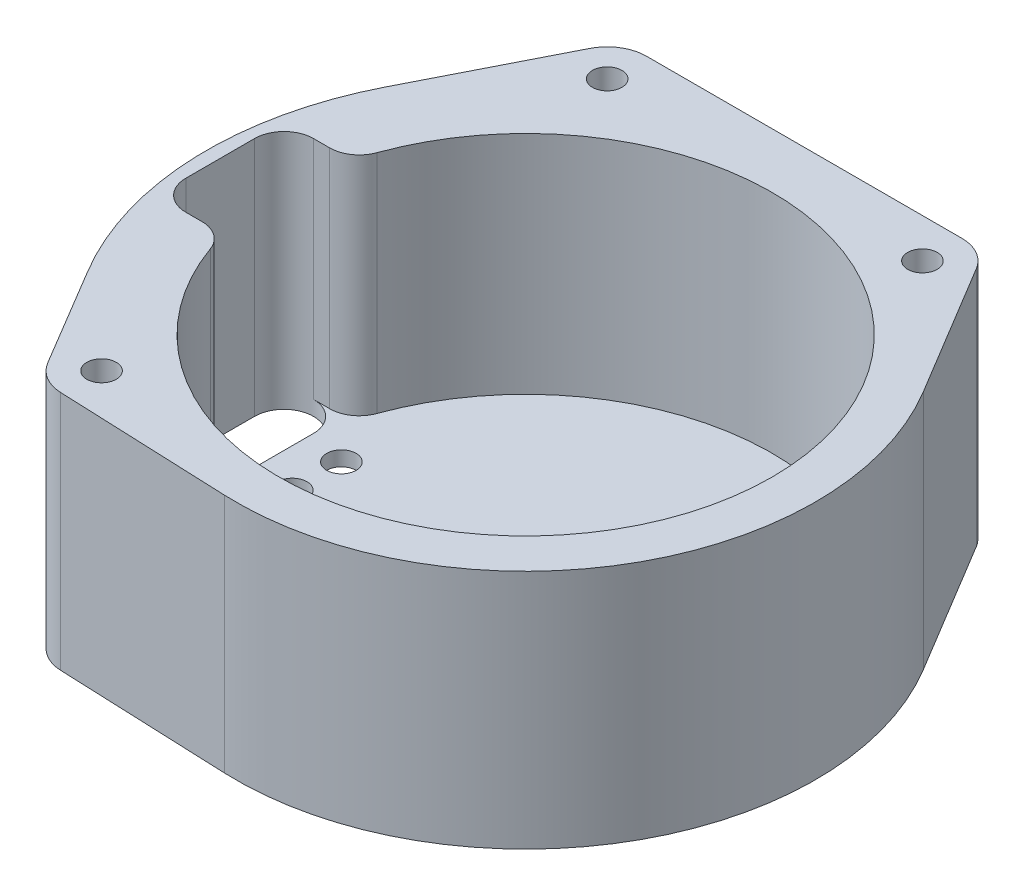
ISO-10303-21;
HEADER;
FILE_DESCRIPTION(('STEP AP214'),'2;1');
FILE_NAME('part.step','',(''),(''),'','','');
FILE_SCHEMA(('AUTOMOTIVE_DESIGN { 1 0 10303 214 1 1 1 1 }'));
ENDSEC;
DATA;
#1=APPLICATION_CONTEXT('core data for automotive mechanical design processes');
#2=APPLICATION_PROTOCOL_DEFINITION('international standard','automotive_design',2000,#1);
#3=PRODUCT_CONTEXT('',#1,'mechanical');
#4=PRODUCT('Part','Part','',(#3));
#5=PRODUCT_RELATED_PRODUCT_CATEGORY('part','',(#4));
#6=PRODUCT_DEFINITION_FORMATION('','',#4);
#7=PRODUCT_DEFINITION_CONTEXT('part definition',#1,'design');
#8=PRODUCT_DEFINITION('design','',#6,#7);
#9=PRODUCT_DEFINITION_SHAPE('','',#8);
#10=(LENGTH_UNIT() NAMED_UNIT(*) SI_UNIT(.MILLI.,.METRE.));
#11=(NAMED_UNIT(*) PLANE_ANGLE_UNIT() SI_UNIT($,.RADIAN.));
#12=(NAMED_UNIT(*) SI_UNIT($,.STERADIAN.) SOLID_ANGLE_UNIT());
#13=UNCERTAINTY_MEASURE_WITH_UNIT(LENGTH_MEASURE(1.E-05),#10,'distance_accuracy_value','');
#14=(GEOMETRIC_REPRESENTATION_CONTEXT(3) GLOBAL_UNCERTAINTY_ASSIGNED_CONTEXT((#13)) GLOBAL_UNIT_ASSIGNED_CONTEXT((#10,
#11,#12)) REPRESENTATION_CONTEXT('',''));
#15=CARTESIAN_POINT('',(0.,0.,0.));
#16=DIRECTION('',(0.,0.,1.));
#17=DIRECTION('',(1.,0.,0.));
#18=AXIS2_PLACEMENT_3D('',#15,#16,#17);
#19=CARTESIAN_POINT('',(-18.4083036841292,23.,-26.7110072700086));
#20=DIRECTION('',(0.,1.,0.));
#21=DIRECTION('',(0.,0.,1.));
#22=AXIS2_PLACEMENT_3D('',#19,#20,#21);
#23=PLANE('',#22);
#24=CARTESIAN_POINT('',(-18.4083036841292,23.,-26.7110072700086));
#25=DIRECTION('',(0.,1.,0.));
#26=DIRECTION('',(0.,0.,1.));
#27=AXIS2_PLACEMENT_3D('',#24,#25,#26);
#28=CIRCLE('',#27,1.5);
#29=CARTESIAN_POINT('',(-18.4083036841292,23.,-25.2110072700086));
#30=VERTEX_POINT('',#29);
#31=EDGE_CURVE('E280',#30,#30,#28,.T.);
#32=ORIENTED_EDGE('',*,*,#31,.F.);
#33=EDGE_LOOP('',(#32));
#34=FACE_BOUND('',#33,.T.);
#35=CARTESIAN_POINT('',(-18.4083036841292,23.,-26.7110072700086));
#36=DIRECTION('',(0.,1.,0.));
#37=DIRECTION('',(0.,0.,1.));
#38=AXIS2_PLACEMENT_3D('',#35,#36,#37);
#39=CIRCLE('',#38,4.00000000000001);
#40=CARTESIAN_POINT('',(-18.4083036841292,23.,-30.7110072700086));
#41=VERTEX_POINT('',#40);
#42=CARTESIAN_POINT('',(-21.9756650888363,23.,-28.520408443935));
#43=VERTEX_POINT('',#42);
#44=EDGE_CURVE('E286',#41,#43,#39,.T.);
#45=ORIENTED_EDGE('',*,*,#44,.T.);
#46=DIRECTION('',(-0.452350293481598,0.,0.891840351176774));
#47=VECTOR('',#46,1.);
#48=CARTESIAN_POINT('',(-28.9848114132452,23.,-14.7013845381519));
#49=LINE('',#48,#47);
#50=CARTESIAN_POINT('',(-28.9848114132452,23.,-14.701384538152));
#51=VERTEX_POINT('',#50);
#52=EDGE_CURVE('E289',#43,#51,#49,.T.);
#53=ORIENTED_EDGE('',*,*,#52,.T.);
#54=CARTESIAN_POINT('',(0.,23.,0.));
#55=DIRECTION('',(0.,1.,0.));
#56=DIRECTION('',(0.,0.,1.));
#57=AXIS2_PLACEMENT_3D('',#54,#55,#56);
#58=CIRCLE('',#57,32.5);
#59=CARTESIAN_POINT('',(-27.9086101673609,23.,16.6541129612562));
#60=VERTEX_POINT('',#59);
#61=EDGE_CURVE('E291',#51,#60,#58,.T.);
#62=ORIENTED_EDGE('',*,*,#61,.T.);
#63=DIRECTION('',(0.512434244961728,0.,0.858726466688027));
#64=VECTOR('',#63,1.);
#65=CARTESIAN_POINT('',(-21.8432095508813,23.,26.8183829952113));
#66=LINE('',#65,#64);
#67=CARTESIAN_POINT('',(-21.8432095508813,23.,26.8183829952113));
#68=VERTEX_POINT('',#67);
#69=EDGE_CURVE('E293',#60,#68,#66,.T.);
#70=ORIENTED_EDGE('',*,*,#69,.T.);
#71=CARTESIAN_POINT('',(-18.4083036841292,23.,24.7686460153643));
#72=DIRECTION('',(0.,1.,0.));
#73=DIRECTION('',(0.,0.,1.));
#74=AXIS2_PLACEMENT_3D('',#71,#72,#73);
#75=CIRCLE('',#74,4.);
#76=CARTESIAN_POINT('',(-18.5717150447436,23.,28.7653067123991));
#77=VERTEX_POINT('',#76);
#78=EDGE_CURVE('E295',#68,#77,#75,.T.);
#79=ORIENTED_EDGE('',*,*,#78,.T.);
#80=DIRECTION('',(0.999165174258683,0.,0.0408528401536111));
#81=VECTOR('',#80,1.);
#82=CARTESIAN_POINT('',(-18.5717150447436,23.,28.7653067123991));
#83=LINE('',#82,#81);
#84=CARTESIAN_POINT('',(-1.20515878453155,23.,29.4753726406311));
#85=VERTEX_POINT('',#84);
#86=EDGE_CURVE('E297',#77,#85,#83,.T.);
#87=ORIENTED_EDGE('',*,*,#86,.T.);
#88=CARTESIAN_POINT('',(0.,23.,0.));
#89=DIRECTION('',(0.,1.,0.));
#90=DIRECTION('',(0.,0.,1.));
#91=AXIS2_PLACEMENT_3D('',#88,#89,#90);
#92=CIRCLE('',#91,29.5);
#93=CARTESIAN_POINT('',(25.2769395180324,23.,-15.2094157876538));
#94=VERTEX_POINT('',#93);
#95=EDGE_CURVE('E299',#85,#94,#92,.T.);
#96=ORIENTED_EDGE('',*,*,#95,.T.);
#97=DIRECTION('',(-0.515573416530637,0.,-0.856845407390928));
#98=VECTOR('',#97,1.);
#99=CARTESIAN_POINT('',(17.1153988864222,23.,-28.7733009361312));
#100=LINE('',#99,#98);
#101=CARTESIAN_POINT('',(17.1153988864222,23.,-28.7733009361312));
#102=VERTEX_POINT('',#101);
#103=EDGE_CURVE('E301',#94,#102,#100,.T.);
#104=ORIENTED_EDGE('',*,*,#103,.T.);
#105=CARTESIAN_POINT('',(13.6880172568585,23.,-26.7110072700086));
#106=DIRECTION('',(0.,1.,0.));
#107=DIRECTION('',(0.,0.,1.));
#108=AXIS2_PLACEMENT_3D('',#105,#106,#107);
#109=CIRCLE('',#108,3.99999999999999);
#110=CARTESIAN_POINT('',(13.6880172568585,23.,-30.7110072700086));
#111=VERTEX_POINT('',#110);
#112=EDGE_CURVE('E303',#102,#111,#109,.T.);
#113=ORIENTED_EDGE('',*,*,#112,.T.);
#114=DIRECTION('',(-1.,0.,0.));
#115=VECTOR('',#114,1.);
#116=CARTESIAN_POINT('',(-18.4083036841292,23.,-30.7110072700086));
#117=LINE('',#116,#115);
#118=EDGE_CURVE('E305',#111,#41,#117,.T.);
#119=ORIENTED_EDGE('',*,*,#118,.T.);
#120=EDGE_LOOP('',(#45,#53,#62,#70,#79,#87,#96,#104,#113,#119));
#121=FACE_BOUND('',#120,.T.);
#122=CARTESIAN_POINT('',(13.6880172568585,23.,-26.7110072700086));
#123=DIRECTION('',(0.,1.,0.));
#124=DIRECTION('',(0.,0.,1.));
#125=AXIS2_PLACEMENT_3D('',#122,#123,#124);
#126=CIRCLE('',#125,1.5);
#127=CARTESIAN_POINT('',(13.6880172568585,23.,-25.2110072700086));
#128=VERTEX_POINT('',#127);
#129=EDGE_CURVE('E283',#128,#128,#126,.T.);
#130=ORIENTED_EDGE('',*,*,#129,.F.);
#131=EDGE_LOOP('',(#130));
#132=FACE_BOUND('',#131,.T.);
#133=CARTESIAN_POINT('',(-18.4083036841292,23.,24.7686460153643));
#134=DIRECTION('',(0.,1.,0.));
#135=DIRECTION('',(0.,0.,1.));
#136=AXIS2_PLACEMENT_3D('',#133,#134,#135);
#137=CIRCLE('',#136,1.5);
#138=CARTESIAN_POINT('',(-18.4083036841292,23.,26.2686460153643));
#139=VERTEX_POINT('',#138);
#140=EDGE_CURVE('E270',#139,#139,#137,.T.);
#141=ORIENTED_EDGE('',*,*,#140,.F.);
#142=EDGE_LOOP('',(#141));
#143=FACE_BOUND('',#142,.T.);
#144=CARTESIAN_POINT('',(0.,23.,0.));
#145=DIRECTION('',(0.,1.,0.));
#146=DIRECTION('',(0.,0.,1.));
#147=AXIS2_PLACEMENT_3D('',#144,#145,#146);
#148=CIRCLE('',#147,25.1);
#149=CARTESIAN_POINT('',(-23.6220615156866,23.,8.48576512455516));
#150=VERTEX_POINT('',#149);
#151=CARTESIAN_POINT('',(-23.6220615156866,23.,-8.48576512455516));
#152=VERTEX_POINT('',#151);
#153=EDGE_CURVE('E263',#150,#152,#148,.T.);
#154=ORIENTED_EDGE('',*,*,#153,.F.);
#155=CARTESIAN_POINT('',(-26.445415481705,23.,9.5));
#156=DIRECTION('',(0.,1.,0.));
#157=DIRECTION('',(0.,0.,1.));
#158=AXIS2_PLACEMENT_3D('',#155,#156,#157);
#159=CIRCLE('',#158,3.);
#160=CARTESIAN_POINT('',(-26.445415481705,23.,6.5));
#161=VERTEX_POINT('',#160);
#162=EDGE_CURVE('E345',#150,#161,#159,.T.);
#163=ORIENTED_EDGE('',*,*,#162,.T.);
#164=DIRECTION('',(1.,0.,0.));
#165=VECTOR('',#164,1.);
#166=CARTESIAN_POINT('',(-31.1,23.,6.5));
#167=LINE('',#166,#165);
#168=CARTESIAN_POINT('',(-28.1,23.,6.5));
#169=VERTEX_POINT('',#168);
#170=EDGE_CURVE('E260',#169,#161,#167,.T.);
#171=ORIENTED_EDGE('',*,*,#170,.F.);
#172=CARTESIAN_POINT('',(-28.1,23.,3.5));
#173=DIRECTION('',(0.,1.,0.));
#174=DIRECTION('',(0.,0.,1.));
#175=AXIS2_PLACEMENT_3D('',#172,#173,#174);
#176=CIRCLE('',#175,3.);
#177=CARTESIAN_POINT('',(-31.1,23.,3.5));
#178=VERTEX_POINT('',#177);
#179=EDGE_CURVE('E43',#169,#178,#176,.F.);
#180=ORIENTED_EDGE('',*,*,#179,.T.);
#181=DIRECTION('',(0.,0.,1.));
#182=VECTOR('',#181,1.);
#183=CARTESIAN_POINT('',(-31.1,23.,6.5));
#184=LINE('',#183,#182);
#185=CARTESIAN_POINT('',(-31.1,23.,-3.5));
#186=VERTEX_POINT('',#185);
#187=EDGE_CURVE('E178',#186,#178,#184,.T.);
#188=ORIENTED_EDGE('',*,*,#187,.F.);
#189=CARTESIAN_POINT('',(-28.1,23.,-3.5));
#190=DIRECTION('',(0.,1.,0.));
#191=DIRECTION('',(0.,0.,1.));
#192=AXIS2_PLACEMENT_3D('',#189,#190,#191);
#193=CIRCLE('',#192,3.);
#194=CARTESIAN_POINT('',(-28.1,23.,-6.5));
#195=VERTEX_POINT('',#194);
#196=EDGE_CURVE('E11',#186,#195,#193,.F.);
#197=ORIENTED_EDGE('',*,*,#196,.T.);
#198=DIRECTION('',(-1.,0.,0.));
#199=VECTOR('',#198,1.);
#200=CARTESIAN_POINT('',(-31.1,23.,-6.5));
#201=LINE('',#200,#199);
#202=CARTESIAN_POINT('',(-26.445415481705,23.,-6.5));
#203=VERTEX_POINT('',#202);
#204=EDGE_CURVE('E267',#203,#195,#201,.T.);
#205=ORIENTED_EDGE('',*,*,#204,.F.);
#206=CARTESIAN_POINT('',(-26.445415481705,23.,-9.5));
#207=DIRECTION('',(0.,1.,0.));
#208=DIRECTION('',(0.,0.,1.));
#209=AXIS2_PLACEMENT_3D('',#206,#207,#208);
#210=CIRCLE('',#209,3.);
#211=EDGE_CURVE('E343',#203,#152,#210,.T.);
#212=ORIENTED_EDGE('',*,*,#211,.T.);
#213=EDGE_LOOP('',(#154,#163,#171,#180,#188,#197,#205,#212));
#214=FACE_BOUND('',#213,.T.);
#215=ADVANCED_FACE('F35',(#34,#121,#132,#143,#214),#23,.T.);
#216=CARTESIAN_POINT('',(-18.4083036841292,23.,-26.7110072700086));
#217=DIRECTION('',(0.,-1.,0.));
#218=DIRECTION('',(0.,0.,-1.));
#219=AXIS2_PLACEMENT_3D('',#216,#217,#218);
#220=CYLINDRICAL_SURFACE('',#219,4.00000000000001);
#221=DIRECTION('',(0.,-1.,0.));
#222=VECTOR('',#221,1.);
#223=CARTESIAN_POINT('',(-18.4083036841292,23.,-30.7110072700086));
#224=LINE('',#223,#222);
#225=CARTESIAN_POINT('',(-18.4083036841292,-1.5,-30.7110072700086));
#226=VERTEX_POINT('',#225);
#227=EDGE_CURVE('E307',#41,#226,#224,.T.);
#228=ORIENTED_EDGE('',*,*,#227,.T.);
#229=CARTESIAN_POINT('',(-18.4083036841292,-1.5,-26.7110072700086));
#230=DIRECTION('',(0.,-1.,0.));
#231=DIRECTION('',(0.,0.,-1.));
#232=AXIS2_PLACEMENT_3D('',#229,#230,#231);
#233=CIRCLE('',#232,4.);
#234=CARTESIAN_POINT('',(-21.9756650888363,-1.5,-28.520408443935));
#235=VERTEX_POINT('',#234);
#236=EDGE_CURVE('E227',#235,#226,#233,.T.);
#237=ORIENTED_EDGE('',*,*,#236,.F.);
#238=DIRECTION('',(0.,-1.,0.));
#239=VECTOR('',#238,1.);
#240=CARTESIAN_POINT('',(-21.9756650888363,23.,-28.520408443935));
#241=LINE('',#240,#239);
#242=EDGE_CURVE('E325',#43,#235,#241,.T.);
#243=ORIENTED_EDGE('',*,*,#242,.F.);
#244=ORIENTED_EDGE('',*,*,#44,.F.);
#245=EDGE_LOOP('',(#228,#237,#243,#244));
#246=FACE_BOUND('',#245,.T.);
#247=ADVANCED_FACE('F387',(#246),#220,.T.);
#248=CARTESIAN_POINT('',(-28.9848114132452,23.,-14.7013845381519));
#249=DIRECTION('',(0.891840351176774,0.,0.452350293481598));
#250=DIRECTION('',(0.452350293481598,0.,-0.891840351176775));
#251=AXIS2_PLACEMENT_3D('',#248,#249,#250);
#252=PLANE('',#251);
#253=ORIENTED_EDGE('',*,*,#242,.T.);
#254=DIRECTION('',(0.452350293481598,0.,-0.891840351176774));
#255=VECTOR('',#254,1.);
#256=CARTESIAN_POINT('',(-28.9848114132452,-1.5,-14.701384538152));
#257=LINE('',#256,#255);
#258=CARTESIAN_POINT('',(-28.9848114132452,-1.5,-14.701384538152));
#259=VERTEX_POINT('',#258);
#260=EDGE_CURVE('E256',#259,#235,#257,.T.);
#261=ORIENTED_EDGE('',*,*,#260,.F.);
#262=DIRECTION('',(0.,-1.,0.));
#263=VECTOR('',#262,1.);
#264=CARTESIAN_POINT('',(-28.9848114132452,23.,-14.701384538152));
#265=LINE('',#264,#263);
#266=EDGE_CURVE('E323',#51,#259,#265,.T.);
#267=ORIENTED_EDGE('',*,*,#266,.F.);
#268=ORIENTED_EDGE('',*,*,#52,.F.);
#269=EDGE_LOOP('',(#253,#261,#267,#268));
#270=FACE_BOUND('',#269,.T.);
#271=ADVANCED_FACE('F393',(#270),#252,.F.);
#272=CARTESIAN_POINT('',(0.,23.,0.));
#273=DIRECTION('',(0.,-1.,0.));
#274=DIRECTION('',(0.,0.,-1.));
#275=AXIS2_PLACEMENT_3D('',#272,#273,#274);
#276=CYLINDRICAL_SURFACE('',#275,32.5);
#277=ORIENTED_EDGE('',*,*,#266,.T.);
#278=CARTESIAN_POINT('',(0.,-1.5,0.));
#279=DIRECTION('',(0.,-1.,0.));
#280=DIRECTION('',(0.,0.,-1.));
#281=AXIS2_PLACEMENT_3D('',#278,#279,#280);
#282=CIRCLE('',#281,32.5);
#283=CARTESIAN_POINT('',(-27.9086101673609,-1.5,16.6541129612562));
#284=VERTEX_POINT('',#283);
#285=EDGE_CURVE('E253',#284,#259,#282,.T.);
#286=ORIENTED_EDGE('',*,*,#285,.F.);
#287=DIRECTION('',(0.,-1.,0.));
#288=VECTOR('',#287,1.);
#289=CARTESIAN_POINT('',(-27.9086101673609,23.,16.6541129612562));
#290=LINE('',#289,#288);
#291=EDGE_CURVE('E321',#60,#284,#290,.T.);
#292=ORIENTED_EDGE('',*,*,#291,.F.);
#293=ORIENTED_EDGE('',*,*,#61,.F.);
#294=EDGE_LOOP('',(#277,#286,#292,#293));
#295=FACE_BOUND('',#294,.T.);
#296=ADVANCED_FACE('F429',(#295),#276,.T.);
#297=CARTESIAN_POINT('',(-21.8432095508813,23.,26.8183829952113));
#298=DIRECTION('',(0.858726466688028,0.,-0.512434244961728));
#299=DIRECTION('',(-0.512434244961728,0.,-0.858726466688028));
#300=AXIS2_PLACEMENT_3D('',#297,#298,#299);
#301=PLANE('',#300);
#302=ORIENTED_EDGE('',*,*,#291,.T.);
#303=DIRECTION('',(-0.512434244961728,0.,-0.858726466688027));
#304=VECTOR('',#303,1.);
#305=CARTESIAN_POINT('',(-21.8432095508813,-1.5,26.8183829952113));
#306=LINE('',#305,#304);
#307=CARTESIAN_POINT('',(-21.8432095508813,-1.5,26.8183829952113));
#308=VERTEX_POINT('',#307);
#309=EDGE_CURVE('E250',#308,#284,#306,.T.);
#310=ORIENTED_EDGE('',*,*,#309,.F.);
#311=DIRECTION('',(0.,-1.,0.));
#312=VECTOR('',#311,1.);
#313=CARTESIAN_POINT('',(-21.8432095508813,23.,26.8183829952113));
#314=LINE('',#313,#312);
#315=EDGE_CURVE('E319',#68,#308,#314,.T.);
#316=ORIENTED_EDGE('',*,*,#315,.F.);
#317=ORIENTED_EDGE('',*,*,#69,.F.);
#318=EDGE_LOOP('',(#302,#310,#316,#317));
#319=FACE_BOUND('',#318,.T.);
#320=ADVANCED_FACE('F425',(#319),#301,.F.);
#321=CARTESIAN_POINT('',(-18.4083036841292,23.,24.7686460153643));
#322=DIRECTION('',(0.,-1.,0.));
#323=DIRECTION('',(0.,0.,-1.));
#324=AXIS2_PLACEMENT_3D('',#321,#322,#323);
#325=CYLINDRICAL_SURFACE('',#324,4.);
#326=ORIENTED_EDGE('',*,*,#315,.T.);
#327=CARTESIAN_POINT('',(-18.4083036841292,-1.5,24.7686460153643));
#328=DIRECTION('',(0.,-1.,0.));
#329=DIRECTION('',(0.,0.,-1.));
#330=AXIS2_PLACEMENT_3D('',#327,#328,#329);
#331=CIRCLE('',#330,4.);
#332=CARTESIAN_POINT('',(-18.5717150447436,-1.5,28.7653067123991));
#333=VERTEX_POINT('',#332);
#334=EDGE_CURVE('E247',#333,#308,#331,.T.);
#335=ORIENTED_EDGE('',*,*,#334,.F.);
#336=DIRECTION('',(0.,-1.,0.));
#337=VECTOR('',#336,1.);
#338=CARTESIAN_POINT('',(-18.5717150447436,23.,28.7653067123991));
#339=LINE('',#338,#337);
#340=EDGE_CURVE('E317',#77,#333,#339,.T.);
#341=ORIENTED_EDGE('',*,*,#340,.F.);
#342=ORIENTED_EDGE('',*,*,#78,.F.);
#343=EDGE_LOOP('',(#326,#335,#341,#342));
#344=FACE_BOUND('',#343,.T.);
#345=ADVANCED_FACE('F421',(#344),#325,.T.);
#346=CARTESIAN_POINT('',(-18.5717150447436,23.,28.7653067123991));
#347=DIRECTION('',(0.0408528401536111,0.,-0.999165174258682));
#348=DIRECTION('',(-0.999165174258683,0.,-0.0408528401536111));
#349=AXIS2_PLACEMENT_3D('',#346,#347,#348);
#350=PLANE('',#349);
#351=ORIENTED_EDGE('',*,*,#340,.T.);
#352=DIRECTION('',(-0.999165174258683,0.,-0.0408528401536111));
#353=VECTOR('',#352,1.);
#354=CARTESIAN_POINT('',(-1.20515878453154,-1.5,29.4753726406311));
#355=LINE('',#354,#353);
#356=CARTESIAN_POINT('',(-1.20515878453154,-1.5,29.4753726406311));
#357=VERTEX_POINT('',#356);
#358=EDGE_CURVE('E244',#357,#333,#355,.T.);
#359=ORIENTED_EDGE('',*,*,#358,.F.);
#360=DIRECTION('',(0.,-1.,0.));
#361=VECTOR('',#360,1.);
#362=CARTESIAN_POINT('',(-1.20515878453155,23.,29.4753726406311));
#363=LINE('',#362,#361);
#364=EDGE_CURVE('E315',#85,#357,#363,.T.);
#365=ORIENTED_EDGE('',*,*,#364,.F.);
#366=ORIENTED_EDGE('',*,*,#86,.F.);
#367=EDGE_LOOP('',(#351,#359,#365,#366));
#368=FACE_BOUND('',#367,.T.);
#369=ADVANCED_FACE('F417',(#368),#350,.F.);
#370=CARTESIAN_POINT('',(0.,23.,0.));
#371=DIRECTION('',(0.,-1.,0.));
#372=DIRECTION('',(0.,0.,-1.));
#373=AXIS2_PLACEMENT_3D('',#370,#371,#372);
#374=CYLINDRICAL_SURFACE('',#373,29.5);
#375=ORIENTED_EDGE('',*,*,#364,.T.);
#376=CARTESIAN_POINT('',(0.,-1.5,0.));
#377=DIRECTION('',(0.,-1.,0.));
#378=DIRECTION('',(0.,0.,-1.));
#379=AXIS2_PLACEMENT_3D('',#376,#377,#378);
#380=CIRCLE('',#379,29.5);
#381=CARTESIAN_POINT('',(25.2769395180324,-1.5,-15.2094157876538));
#382=VERTEX_POINT('',#381);
#383=EDGE_CURVE('E241',#382,#357,#380,.T.);
#384=ORIENTED_EDGE('',*,*,#383,.F.);
#385=DIRECTION('',(0.,-1.,0.));
#386=VECTOR('',#385,1.);
#387=CARTESIAN_POINT('',(25.2769395180324,23.,-15.2094157876538));
#388=LINE('',#387,#386);
#389=EDGE_CURVE('E313',#94,#382,#388,.T.);
#390=ORIENTED_EDGE('',*,*,#389,.F.);
#391=ORIENTED_EDGE('',*,*,#95,.F.);
#392=EDGE_LOOP('',(#375,#384,#390,#391));
#393=FACE_BOUND('',#392,.T.);
#394=ADVANCED_FACE('F413',(#393),#374,.T.);
#395=CARTESIAN_POINT('',(17.1153988864222,23.,-28.7733009361312));
#396=DIRECTION('',(-0.856845407390929,0.,0.515573416530637));
#397=DIRECTION('',(0.515573416530637,0.,0.856845407390929));
#398=AXIS2_PLACEMENT_3D('',#395,#396,#397);
#399=PLANE('',#398);
#400=ORIENTED_EDGE('',*,*,#389,.T.);
#401=DIRECTION('',(0.515573416530637,0.,0.856845407390929));
#402=VECTOR('',#401,1.);
#403=CARTESIAN_POINT('',(17.1153988864222,-1.5,-28.7733009361312));
#404=LINE('',#403,#402);
#405=CARTESIAN_POINT('',(17.1153988864222,-1.5,-28.7733009361312));
#406=VERTEX_POINT('',#405);
#407=EDGE_CURVE('E238',#406,#382,#404,.T.);
#408=ORIENTED_EDGE('',*,*,#407,.F.);
#409=DIRECTION('',(0.,-1.,0.));
#410=VECTOR('',#409,1.);
#411=CARTESIAN_POINT('',(17.1153988864222,23.,-28.7733009361312));
#412=LINE('',#411,#410);
#413=EDGE_CURVE('E311',#102,#406,#412,.T.);
#414=ORIENTED_EDGE('',*,*,#413,.F.);
#415=ORIENTED_EDGE('',*,*,#103,.F.);
#416=EDGE_LOOP('',(#400,#408,#414,#415));
#417=FACE_BOUND('',#416,.T.);
#418=ADVANCED_FACE('F409',(#417),#399,.F.);
#419=CARTESIAN_POINT('',(13.6880172568585,23.,-26.7110072700086));
#420=DIRECTION('',(0.,-1.,0.));
#421=DIRECTION('',(0.,0.,-1.));
#422=AXIS2_PLACEMENT_3D('',#419,#420,#421);
#423=CYLINDRICAL_SURFACE('',#422,3.99999999999999);
#424=ORIENTED_EDGE('',*,*,#413,.T.);
#425=CARTESIAN_POINT('',(13.6880172568585,-1.5,-26.7110072700086));
#426=DIRECTION('',(0.,-1.,0.));
#427=DIRECTION('',(0.,0.,-1.));
#428=AXIS2_PLACEMENT_3D('',#425,#426,#427);
#429=CIRCLE('',#428,4.);
#430=CARTESIAN_POINT('',(13.6880172568585,-1.5,-30.7110072700086));
#431=VERTEX_POINT('',#430);
#432=EDGE_CURVE('E235',#431,#406,#429,.T.);
#433=ORIENTED_EDGE('',*,*,#432,.F.);
#434=DIRECTION('',(0.,-1.,0.));
#435=VECTOR('',#434,1.);
#436=CARTESIAN_POINT('',(13.6880172568585,23.,-30.7110072700086));
#437=LINE('',#436,#435);
#438=EDGE_CURVE('E309',#111,#431,#437,.T.);
#439=ORIENTED_EDGE('',*,*,#438,.F.);
#440=ORIENTED_EDGE('',*,*,#112,.F.);
#441=EDGE_LOOP('',(#424,#433,#439,#440));
#442=FACE_BOUND('',#441,.T.);
#443=ADVANCED_FACE('F405',(#442),#423,.T.);
#444=CARTESIAN_POINT('',(-18.4083036841292,23.,-30.7110072700086));
#445=DIRECTION('',(0.,0.,1.));
#446=DIRECTION('',(1.,0.,0.));
#447=AXIS2_PLACEMENT_3D('',#444,#445,#446);
#448=PLANE('',#447);
#449=ORIENTED_EDGE('',*,*,#438,.T.);
#450=DIRECTION('',(1.,0.,0.));
#451=VECTOR('',#450,1.);
#452=CARTESIAN_POINT('',(-18.4083036841292,-1.5,-30.7110072700086));
#453=LINE('',#452,#451);
#454=EDGE_CURVE('E232',#226,#431,#453,.T.);
#455=ORIENTED_EDGE('',*,*,#454,.F.);
#456=ORIENTED_EDGE('',*,*,#227,.F.);
#457=ORIENTED_EDGE('',*,*,#118,.F.);
#458=EDGE_LOOP('',(#449,#455,#456,#457));
#459=FACE_BOUND('',#458,.T.);
#460=ADVANCED_FACE('F402',(#459),#448,.F.);
#461=CARTESIAN_POINT('',(13.6880172568585,23.,-26.7110072700086));
#462=DIRECTION('',(0.,-1.,0.));
#463=DIRECTION('',(0.,0.,-1.));
#464=AXIS2_PLACEMENT_3D('',#461,#462,#463);
#465=CYLINDRICAL_SURFACE('',#464,1.5);
#466=ORIENTED_EDGE('',*,*,#129,.T.);
#467=EDGE_LOOP('',(#466));
#468=FACE_BOUND('',#467,.T.);
#469=CARTESIAN_POINT('',(13.6880172568585,-1.5,-26.7110072700086));
#470=DIRECTION('',(0.,-1.,0.));
#471=DIRECTION('',(0.,0.,-1.));
#472=AXIS2_PLACEMENT_3D('',#469,#470,#471);
#473=CIRCLE('',#472,1.5);
#474=CARTESIAN_POINT('',(13.6880172568585,-1.5,-28.2110072700086));
#475=VERTEX_POINT('',#474);
#476=EDGE_CURVE('E220',#475,#475,#473,.T.);
#477=ORIENTED_EDGE('',*,*,#476,.T.);
#478=EDGE_LOOP('',(#477));
#479=FACE_BOUND('',#478,.T.);
#480=ADVANCED_FACE('F400',(#468,#479),#465,.F.);
#481=CARTESIAN_POINT('',(-18.4083036841292,23.,-26.7110072700086));
#482=DIRECTION('',(0.,-1.,0.));
#483=DIRECTION('',(0.,0.,-1.));
#484=AXIS2_PLACEMENT_3D('',#481,#482,#483);
#485=CYLINDRICAL_SURFACE('',#484,1.5);
#486=ORIENTED_EDGE('',*,*,#31,.T.);
#487=EDGE_LOOP('',(#486));
#488=FACE_BOUND('',#487,.T.);
#489=CARTESIAN_POINT('',(-18.4083036841292,-1.5,-26.7110072700086));
#490=DIRECTION('',(0.,-1.,0.));
#491=DIRECTION('',(0.,0.,-1.));
#492=AXIS2_PLACEMENT_3D('',#489,#490,#491);
#493=CIRCLE('',#492,1.5);
#494=CARTESIAN_POINT('',(-18.4083036841292,-1.5,-28.2110072700086));
#495=VERTEX_POINT('',#494);
#496=EDGE_CURVE('E217',#495,#495,#493,.T.);
#497=ORIENTED_EDGE('',*,*,#496,.T.);
#498=EDGE_LOOP('',(#497));
#499=FACE_BOUND('',#498,.T.);
#500=ADVANCED_FACE('F383',(#488,#499),#485,.F.);
#501=CARTESIAN_POINT('',(-18.4083036841292,23.,24.7686460153643));
#502=DIRECTION('',(0.,-1.,0.));
#503=DIRECTION('',(0.,0.,-1.));
#504=AXIS2_PLACEMENT_3D('',#501,#502,#503);
#505=CYLINDRICAL_SURFACE('',#504,1.5);
#506=ORIENTED_EDGE('',*,*,#140,.T.);
#507=EDGE_LOOP('',(#506));
#508=FACE_BOUND('',#507,.T.);
#509=CARTESIAN_POINT('',(-18.4083036841292,-1.5,24.7686460153643));
#510=DIRECTION('',(0.,-1.,0.));
#511=DIRECTION('',(0.,0.,-1.));
#512=AXIS2_PLACEMENT_3D('',#509,#510,#511);
#513=CIRCLE('',#512,1.5);
#514=CARTESIAN_POINT('',(-18.4083036841292,-1.5,23.2686460153643));
#515=VERTEX_POINT('',#514);
#516=EDGE_CURVE('E214',#515,#515,#513,.T.);
#517=ORIENTED_EDGE('',*,*,#516,.T.);
#518=EDGE_LOOP('',(#517));
#519=FACE_BOUND('',#518,.T.);
#520=ADVANCED_FACE('F376',(#508,#519),#505,.F.);
#521=CARTESIAN_POINT('',(-31.1,23.,6.5));
#522=DIRECTION('',(0.,0.,-1.));
#523=DIRECTION('',(-1.,0.,0.));
#524=AXIS2_PLACEMENT_3D('',#521,#522,#523);
#525=PLANE('',#524);
#526=ORIENTED_EDGE('',*,*,#170,.T.);
#527=DIRECTION('',(0.,-1.,0.));
#528=VECTOR('',#527,1.);
#529=CARTESIAN_POINT('',(-26.445415481705,23.,6.5));
#530=LINE('',#529,#528);
#531=CARTESIAN_POINT('',(-26.445415481705,0.,6.5));
#532=VERTEX_POINT('',#531);
#533=EDGE_CURVE('E329',#161,#532,#530,.T.);
#534=ORIENTED_EDGE('',*,*,#533,.T.);
#535=DIRECTION('',(1.,0.,0.));
#536=VECTOR('',#535,1.);
#537=CARTESIAN_POINT('',(-31.1,0.,6.5));
#538=LINE('',#537,#536);
#539=CARTESIAN_POINT('',(-28.1,0.,6.5));
#540=VERTEX_POINT('',#539);
#541=EDGE_CURVE('E259',#540,#532,#538,.T.);
#542=ORIENTED_EDGE('',*,*,#541,.F.);
#543=DIRECTION('',(0.,-1.,0.));
#544=VECTOR('',#543,1.);
#545=CARTESIAN_POINT('',(-28.1,23.,6.5));
#546=LINE('',#545,#544);
#547=EDGE_CURVE('E327',#540,#169,#546,.F.);
#548=ORIENTED_EDGE('',*,*,#547,.T.);
#549=EDGE_LOOP('',(#526,#534,#542,#548));
#550=FACE_BOUND('',#549,.T.);
#551=ADVANCED_FACE('F374',(#550),#525,.T.);
#552=CARTESIAN_POINT('',(0.,23.,0.));
#553=DIRECTION('',(0.,-1.,0.));
#554=DIRECTION('',(0.,0.,-1.));
#555=AXIS2_PLACEMENT_3D('',#552,#553,#554);
#556=CYLINDRICAL_SURFACE('',#555,25.1);
#557=CARTESIAN_POINT('',(0.,0.,0.));
#558=DIRECTION('',(0.,1.,0.));
#559=DIRECTION('',(0.,0.,1.));
#560=AXIS2_PLACEMENT_3D('',#557,#558,#559);
#561=CIRCLE('',#560,25.1);
#562=CARTESIAN_POINT('',(-23.6220615156866,0.,8.48576512455516));
#563=VERTEX_POINT('',#562);
#564=CARTESIAN_POINT('',(-23.6220615156866,0.,-8.48576512455516));
#565=VERTEX_POINT('',#564);
#566=EDGE_CURVE('E273',#563,#565,#561,.T.);
#567=ORIENTED_EDGE('',*,*,#566,.F.);
#568=DIRECTION('',(0.,-1.,0.));
#569=VECTOR('',#568,1.);
#570=CARTESIAN_POINT('',(-23.6220615156866,23.,8.48576512455516));
#571=LINE('',#570,#569);
#572=EDGE_CURVE('E341',#563,#150,#571,.F.);
#573=ORIENTED_EDGE('',*,*,#572,.T.);
#574=ORIENTED_EDGE('',*,*,#153,.T.);
#575=DIRECTION('',(0.,-1.,0.));
#576=VECTOR('',#575,1.);
#577=CARTESIAN_POINT('',(-23.6220615156866,23.,-8.48576512455516));
#578=LINE('',#577,#576);
#579=EDGE_CURVE('E338',#152,#565,#578,.T.);
#580=ORIENTED_EDGE('',*,*,#579,.T.);
#581=EDGE_LOOP('',(#567,#573,#574,#580));
#582=FACE_BOUND('',#581,.T.);
#583=ADVANCED_FACE('F368',(#582),#556,.F.);
#584=CARTESIAN_POINT('',(-31.1,23.,-6.5));
#585=DIRECTION('',(0.,0.,1.));
#586=DIRECTION('',(1.,0.,0.));
#587=AXIS2_PLACEMENT_3D('',#584,#585,#586);
#588=PLANE('',#587);
#589=DIRECTION('',(-1.,0.,0.));
#590=VECTOR('',#589,1.);
#591=CARTESIAN_POINT('',(-31.1,0.,-6.5));
#592=LINE('',#591,#590);
#593=CARTESIAN_POINT('',(-26.445415481705,0.,-6.5));
#594=VERTEX_POINT('',#593);
#595=CARTESIAN_POINT('',(-28.1,0.,-6.5));
#596=VERTEX_POINT('',#595);
#597=EDGE_CURVE('E264',#594,#596,#592,.T.);
#598=ORIENTED_EDGE('',*,*,#597,.F.);
#599=DIRECTION('',(0.,-1.,0.));
#600=VECTOR('',#599,1.);
#601=CARTESIAN_POINT('',(-26.445415481705,23.,-6.5));
#602=LINE('',#601,#600);
#603=EDGE_CURVE('E55',#594,#203,#602,.F.);
#604=ORIENTED_EDGE('',*,*,#603,.T.);
#605=ORIENTED_EDGE('',*,*,#204,.T.);
#606=DIRECTION('',(0.,-1.,0.));
#607=VECTOR('',#606,1.);
#608=CARTESIAN_POINT('',(-28.1,0.,-6.5));
#609=LINE('',#608,#607);
#610=EDGE_CURVE('E347',#195,#596,#609,.T.);
#611=ORIENTED_EDGE('',*,*,#610,.T.);
#612=EDGE_LOOP('',(#598,#604,#605,#611));
#613=FACE_BOUND('',#612,.T.);
#614=ADVANCED_FACE('F362',(#613),#588,.T.);
#615=CARTESIAN_POINT('',(-31.1,23.,6.5));
#616=DIRECTION('',(1.,0.,0.));
#617=DIRECTION('',(0.,0.,-1.));
#618=AXIS2_PLACEMENT_3D('',#615,#616,#617);
#619=PLANE('',#618);
#620=ORIENTED_EDGE('',*,*,#187,.T.);
#621=DIRECTION('',(0.,-1.,0.));
#622=VECTOR('',#621,1.);
#623=CARTESIAN_POINT('',(-31.1,0.,3.5));
#624=LINE('',#623,#622);
#625=CARTESIAN_POINT('',(-31.1,-1.5,3.5));
#626=VERTEX_POINT('',#625);
#627=EDGE_CURVE('E172',#178,#626,#624,.T.);
#628=ORIENTED_EDGE('',*,*,#627,.T.);
#629=DIRECTION('',(0.,0.,-1.));
#630=VECTOR('',#629,1.);
#631=CARTESIAN_POINT('',(-31.1,-1.5,3.5));
#632=LINE('',#631,#630);
#633=CARTESIAN_POINT('',(-31.1,-1.5,-3.5));
#634=VERTEX_POINT('',#633);
#635=EDGE_CURVE('E176',#626,#634,#632,.T.);
#636=ORIENTED_EDGE('',*,*,#635,.T.);
#637=DIRECTION('',(0.,-1.,0.));
#638=VECTOR('',#637,1.);
#639=CARTESIAN_POINT('',(-31.1,23.,-3.5));
#640=LINE('',#639,#638);
#641=EDGE_CURVE('E181',#634,#186,#640,.F.);
#642=ORIENTED_EDGE('',*,*,#641,.T.);
#643=EDGE_LOOP('',(#620,#628,#636,#642));
#644=FACE_BOUND('',#643,.T.);
#645=ADVANCED_FACE('F174',(#644),#619,.T.);
#646=CARTESIAN_POINT('',(-26.445415481705,23.,9.5));
#647=DIRECTION('',(0.,-1.,0.));
#648=DIRECTION('',(0.,0.,-1.));
#649=AXIS2_PLACEMENT_3D('',#646,#647,#648);
#650=CYLINDRICAL_SURFACE('',#649,3.);
#651=ORIENTED_EDGE('',*,*,#162,.F.);
#652=ORIENTED_EDGE('',*,*,#572,.F.);
#653=CARTESIAN_POINT('',(-26.445415481705,0.,9.5));
#654=DIRECTION('',(0.,1.,0.));
#655=DIRECTION('',(0.,0.,1.));
#656=AXIS2_PLACEMENT_3D('',#653,#654,#655);
#657=CIRCLE('',#656,3.);
#658=EDGE_CURVE('E335',#532,#563,#657,.F.);
#659=ORIENTED_EDGE('',*,*,#658,.F.);
#660=ORIENTED_EDGE('',*,*,#533,.F.);
#661=EDGE_LOOP('',(#651,#652,#659,#660));
#662=FACE_BOUND('',#661,.T.);
#663=ADVANCED_FACE('F373',(#662),#650,.T.);
#664=CARTESIAN_POINT('',(-26.445415481705,23.,-9.5));
#665=DIRECTION('',(0.,-1.,0.));
#666=DIRECTION('',(0.,0.,-1.));
#667=AXIS2_PLACEMENT_3D('',#664,#665,#666);
#668=CYLINDRICAL_SURFACE('',#667,3.);
#669=ORIENTED_EDGE('',*,*,#211,.F.);
#670=ORIENTED_EDGE('',*,*,#603,.F.);
#671=CARTESIAN_POINT('',(-26.445415481705,0.,-9.5));
#672=DIRECTION('',(0.,1.,0.));
#673=DIRECTION('',(0.,0.,1.));
#674=AXIS2_PLACEMENT_3D('',#671,#672,#673);
#675=CIRCLE('',#674,3.);
#676=EDGE_CURVE('E332',#565,#594,#675,.F.);
#677=ORIENTED_EDGE('',*,*,#676,.F.);
#678=ORIENTED_EDGE('',*,*,#579,.F.);
#679=EDGE_LOOP('',(#669,#670,#677,#678));
#680=FACE_BOUND('',#679,.T.);
#681=ADVANCED_FACE('F366',(#680),#668,.T.);
#682=CARTESIAN_POINT('',(-28.1,23.,3.5));
#683=DIRECTION('',(0.,1.,0.));
#684=DIRECTION('',(0.,0.,1.));
#685=AXIS2_PLACEMENT_3D('',#682,#683,#684);
#686=CYLINDRICAL_SURFACE('',#685,3.);
#687=ORIENTED_EDGE('',*,*,#179,.F.);
#688=ORIENTED_EDGE('',*,*,#547,.F.);
#689=CARTESIAN_POINT('',(-28.1,0.,3.5));
#690=DIRECTION('',(0.,-1.,0.));
#691=DIRECTION('',(0.,0.,-1.));
#692=AXIS2_PLACEMENT_3D('',#689,#690,#691);
#693=CIRCLE('',#692,3.);
#694=CARTESIAN_POINT('',(-25.1,0.,3.5));
#695=VERTEX_POINT('',#694);
#696=EDGE_CURVE('E202',#695,#540,#693,.T.);
#697=ORIENTED_EDGE('',*,*,#696,.F.);
#698=DIRECTION('',(0.,1.,0.));
#699=VECTOR('',#698,1.);
#700=CARTESIAN_POINT('',(-25.1,-1.5,3.5));
#701=LINE('',#700,#699);
#702=CARTESIAN_POINT('',(-25.1,-1.5,3.5));
#703=VERTEX_POINT('',#702);
#704=EDGE_CURVE('E188',#703,#695,#701,.T.);
#705=ORIENTED_EDGE('',*,*,#704,.F.);
#706=CARTESIAN_POINT('',(-28.1,-1.5,3.5));
#707=DIRECTION('',(0.,-1.,0.));
#708=DIRECTION('',(0.,0.,-1.));
#709=AXIS2_PLACEMENT_3D('',#706,#707,#708);
#710=CIRCLE('',#709,3.);
#711=EDGE_CURVE('E185',#703,#626,#710,.T.);
#712=ORIENTED_EDGE('',*,*,#711,.T.);
#713=ORIENTED_EDGE('',*,*,#627,.F.);
#714=EDGE_LOOP('',(#687,#688,#697,#705,#712,#713));
#715=FACE_BOUND('',#714,.T.);
#716=ADVANCED_FACE('F186',(#715),#686,.F.);
#717=CARTESIAN_POINT('',(-28.1,23.,-3.5));
#718=DIRECTION('',(0.,1.,0.));
#719=DIRECTION('',(0.,0.,1.));
#720=AXIS2_PLACEMENT_3D('',#717,#718,#719);
#721=CYLINDRICAL_SURFACE('',#720,3.);
#722=ORIENTED_EDGE('',*,*,#196,.F.);
#723=ORIENTED_EDGE('',*,*,#641,.F.);
#724=CARTESIAN_POINT('',(-28.1,-1.5,-3.5));
#725=DIRECTION('',(0.,-1.,0.));
#726=DIRECTION('',(0.,0.,-1.));
#727=AXIS2_PLACEMENT_3D('',#724,#725,#726);
#728=CIRCLE('',#727,3.);
#729=CARTESIAN_POINT('',(-25.1,-1.5,-3.5));
#730=VERTEX_POINT('',#729);
#731=EDGE_CURVE('E195',#634,#730,#728,.T.);
#732=ORIENTED_EDGE('',*,*,#731,.T.);
#733=DIRECTION('',(0.,1.,0.));
#734=VECTOR('',#733,1.);
#735=CARTESIAN_POINT('',(-25.1,-1.5,-3.5));
#736=LINE('',#735,#734);
#737=CARTESIAN_POINT('',(-25.1,0.,-3.5));
#738=VERTEX_POINT('',#737);
#739=EDGE_CURVE('E211',#730,#738,#736,.T.);
#740=ORIENTED_EDGE('',*,*,#739,.T.);
#741=CARTESIAN_POINT('',(-28.1,0.,-3.5));
#742=DIRECTION('',(0.,-1.,0.));
#743=DIRECTION('',(0.,0.,-1.));
#744=AXIS2_PLACEMENT_3D('',#741,#742,#743);
#745=CIRCLE('',#744,3.);
#746=EDGE_CURVE('E205',#596,#738,#745,.T.);
#747=ORIENTED_EDGE('',*,*,#746,.F.);
#748=ORIENTED_EDGE('',*,*,#610,.F.);
#749=EDGE_LOOP('',(#722,#723,#732,#740,#747,#748));
#750=FACE_BOUND('',#749,.T.);
#751=ADVANCED_FACE('F37',(#750),#721,.F.);
#752=CARTESIAN_POINT('',(-18.4083036841292,0.,-26.7110072700086));
#753=DIRECTION('',(0.,-1.,0.));
#754=DIRECTION('',(0.,0.,-1.));
#755=AXIS2_PLACEMENT_3D('',#752,#753,#754);
#756=PLANE('',#755);
#757=CARTESIAN_POINT('',(-21.1709233970763,0.,2.58734391893954));
#758=DIRECTION('',(0.,-1.,0.));
#759=DIRECTION('',(0.,0.,-1.));
#760=AXIS2_PLACEMENT_3D('',#757,#758,#759);
#761=CIRCLE('',#760,1.5);
#762=CARTESIAN_POINT('',(-21.1709233970763,0.,1.08734391893954));
#763=VERTEX_POINT('',#762);
#764=EDGE_CURVE('E206',#763,#763,#761,.T.);
#765=ORIENTED_EDGE('',*,*,#764,.T.);
#766=EDGE_LOOP('',(#765));
#767=FACE_BOUND('',#766,.T.);
#768=CARTESIAN_POINT('',(-21.1709236156331,0.,-2.41265417371245));
#769=DIRECTION('',(0.,-1.,0.));
#770=DIRECTION('',(0.,0.,-1.));
#771=AXIS2_PLACEMENT_3D('',#768,#769,#770);
#772=CIRCLE('',#771,1.5);
#773=CARTESIAN_POINT('',(-21.1709236156331,0.,-3.91265417371245));
#774=VERTEX_POINT('',#773);
#775=EDGE_CURVE('E536',#774,#774,#772,.T.);
#776=ORIENTED_EDGE('',*,*,#775,.T.);
#777=EDGE_LOOP('',(#776));
#778=FACE_BOUND('',#777,.T.);
#779=CARTESIAN_POINT('',(0.,0.,0.));
#780=DIRECTION('',(0.,-1.,0.));
#781=DIRECTION('',(0.,0.,-1.));
#782=AXIS2_PLACEMENT_3D('',#779,#780,#781);
#783=CIRCLE('',#782,6.);
#784=CARTESIAN_POINT('',(0.,0.,-6.));
#785=VERTEX_POINT('',#784);
#786=EDGE_CURVE('E223',#785,#785,#783,.T.);
#787=ORIENTED_EDGE('',*,*,#786,.T.);
#788=EDGE_LOOP('',(#787));
#789=FACE_BOUND('',#788,.T.);
#790=ORIENTED_EDGE('',*,*,#696,.T.);
#791=ORIENTED_EDGE('',*,*,#541,.T.);
#792=ORIENTED_EDGE('',*,*,#658,.T.);
#793=ORIENTED_EDGE('',*,*,#566,.T.);
#794=ORIENTED_EDGE('',*,*,#676,.T.);
#795=ORIENTED_EDGE('',*,*,#597,.T.);
#796=ORIENTED_EDGE('',*,*,#746,.T.);
#797=DIRECTION('',(0.,0.,1.));
#798=VECTOR('',#797,1.);
#799=CARTESIAN_POINT('',(-25.1,0.,3.5));
#800=LINE('',#799,#798);
#801=EDGE_CURVE('E191',#738,#695,#800,.T.);
#802=ORIENTED_EDGE('',*,*,#801,.T.);
#803=EDGE_LOOP('',(#790,#791,#792,#793,#794,#795,#796,#802));
#804=FACE_BOUND('',#803,.T.);
#805=ADVANCED_FACE('F355',(#767,#778,#789,#804),#756,.F.);
#806=CARTESIAN_POINT('',(-18.4083036841292,-1.5,-26.7110072700086));
#807=DIRECTION('',(0.,-1.,0.));
#808=DIRECTION('',(0.,0.,-1.));
#809=AXIS2_PLACEMENT_3D('',#806,#807,#808);
#810=PLANE('',#809);
#811=CARTESIAN_POINT('',(-21.1709233970763,-1.5,2.58734391893954));
#812=DIRECTION('',(0.,-1.,0.));
#813=DIRECTION('',(0.,0.,-1.));
#814=AXIS2_PLACEMENT_3D('',#811,#812,#813);
#815=CIRCLE('',#814,1.5);
#816=CARTESIAN_POINT('',(-21.1709233970763,-1.5,1.08734391893954));
#817=VERTEX_POINT('',#816);
#818=EDGE_CURVE('E534',#817,#817,#815,.T.);
#819=ORIENTED_EDGE('',*,*,#818,.F.);
#820=EDGE_LOOP('',(#819));
#821=FACE_BOUND('',#820,.T.);
#822=CARTESIAN_POINT('',(-21.1709236156331,-1.5,-2.41265417371245));
#823=DIRECTION('',(0.,-1.,0.));
#824=DIRECTION('',(0.,0.,-1.));
#825=AXIS2_PLACEMENT_3D('',#822,#823,#824);
#826=CIRCLE('',#825,1.5);
#827=CARTESIAN_POINT('',(-21.1709236156331,-1.5,-3.91265417371245));
#828=VERTEX_POINT('',#827);
#829=EDGE_CURVE('E540',#828,#828,#826,.T.);
#830=ORIENTED_EDGE('',*,*,#829,.F.);
#831=EDGE_LOOP('',(#830));
#832=FACE_BOUND('',#831,.T.);
#833=ORIENTED_EDGE('',*,*,#496,.F.);
#834=EDGE_LOOP('',(#833));
#835=FACE_BOUND('',#834,.T.);
#836=CARTESIAN_POINT('',(0.,-1.5,0.));
#837=DIRECTION('',(0.,-1.,0.));
#838=DIRECTION('',(0.,0.,-1.));
#839=AXIS2_PLACEMENT_3D('',#836,#837,#838);
#840=CIRCLE('',#839,6.);
#841=CARTESIAN_POINT('',(0.,-1.5,-6.));
#842=VERTEX_POINT('',#841);
#843=EDGE_CURVE('E224',#842,#842,#840,.T.);
#844=ORIENTED_EDGE('',*,*,#843,.F.);
#845=EDGE_LOOP('',(#844));
#846=FACE_BOUND('',#845,.T.);
#847=ORIENTED_EDGE('',*,*,#236,.T.);
#848=ORIENTED_EDGE('',*,*,#454,.T.);
#849=ORIENTED_EDGE('',*,*,#432,.T.);
#850=ORIENTED_EDGE('',*,*,#407,.T.);
#851=ORIENTED_EDGE('',*,*,#383,.T.);
#852=ORIENTED_EDGE('',*,*,#358,.T.);
#853=ORIENTED_EDGE('',*,*,#334,.T.);
#854=ORIENTED_EDGE('',*,*,#309,.T.);
#855=ORIENTED_EDGE('',*,*,#285,.T.);
#856=ORIENTED_EDGE('',*,*,#260,.T.);
#857=EDGE_LOOP('',(#847,#848,#849,#850,#851,#852,#853,#854,#855,#856));
#858=FACE_BOUND('',#857,.T.);
#859=ORIENTED_EDGE('',*,*,#476,.F.);
#860=EDGE_LOOP('',(#859));
#861=FACE_BOUND('',#860,.T.);
#862=ORIENTED_EDGE('',*,*,#516,.F.);
#863=EDGE_LOOP('',(#862));
#864=FACE_BOUND('',#863,.T.);
#865=ORIENTED_EDGE('',*,*,#635,.F.);
#866=ORIENTED_EDGE('',*,*,#711,.F.);
#867=DIRECTION('',(0.,0.,1.));
#868=VECTOR('',#867,1.);
#869=CARTESIAN_POINT('',(-25.1,-1.5,3.5));
#870=LINE('',#869,#868);
#871=EDGE_CURVE('E197',#730,#703,#870,.T.);
#872=ORIENTED_EDGE('',*,*,#871,.F.);
#873=ORIENTED_EDGE('',*,*,#731,.F.);
#874=EDGE_LOOP('',(#865,#866,#872,#873));
#875=FACE_BOUND('',#874,.T.);
#876=ADVANCED_FACE('F193',(#821,#832,#835,#846,#858,#861,#864,#875),#810,.T.);
#877=CARTESIAN_POINT('',(0.,-1.5,0.));
#878=DIRECTION('',(0.,1.,0.));
#879=DIRECTION('',(0.,0.,1.));
#880=AXIS2_PLACEMENT_3D('',#877,#878,#879);
#881=CYLINDRICAL_SURFACE('',#880,6.);
#882=ORIENTED_EDGE('',*,*,#843,.T.);
#883=EDGE_LOOP('',(#882));
#884=FACE_BOUND('',#883,.T.);
#885=ORIENTED_EDGE('',*,*,#786,.F.);
#886=EDGE_LOOP('',(#885));
#887=FACE_BOUND('',#886,.T.);
#888=ADVANCED_FACE('F453',(#884,#887),#881,.F.);
#889=CARTESIAN_POINT('',(-25.1,-1.5,3.5));
#890=DIRECTION('',(-1.,0.,0.));
#891=DIRECTION('',(0.,0.,1.));
#892=AXIS2_PLACEMENT_3D('',#889,#890,#891);
#893=PLANE('',#892);
#894=ORIENTED_EDGE('',*,*,#801,.F.);
#895=ORIENTED_EDGE('',*,*,#739,.F.);
#896=ORIENTED_EDGE('',*,*,#871,.T.);
#897=ORIENTED_EDGE('',*,*,#704,.T.);
#898=EDGE_LOOP('',(#894,#895,#896,#897));
#899=FACE_BOUND('',#898,.T.);
#900=ADVANCED_FACE('F359',(#899),#893,.T.);
#901=CARTESIAN_POINT('',(-21.1709236156331,0.5,-2.41265417371245));
#902=DIRECTION('',(0.,-1.,0.));
#903=DIRECTION('',(0.,0.,-1.));
#904=AXIS2_PLACEMENT_3D('',#901,#902,#903);
#905=CYLINDRICAL_SURFACE('',#904,1.5);
#906=ORIENTED_EDGE('',*,*,#829,.T.);
#907=EDGE_LOOP('',(#906));
#908=FACE_BOUND('',#907,.T.);
#909=ORIENTED_EDGE('',*,*,#775,.F.);
#910=EDGE_LOOP('',(#909));
#911=FACE_BOUND('',#910,.T.);
#912=ADVANCED_FACE('F507',(#908,#911),#905,.F.);
#913=CARTESIAN_POINT('',(-21.1709233970763,0.5,2.58734391893954));
#914=DIRECTION('',(0.,-1.,0.));
#915=DIRECTION('',(0.,0.,-1.));
#916=AXIS2_PLACEMENT_3D('',#913,#914,#915);
#917=CYLINDRICAL_SURFACE('',#916,1.5);
#918=ORIENTED_EDGE('',*,*,#818,.T.);
#919=EDGE_LOOP('',(#918));
#920=FACE_BOUND('',#919,.T.);
#921=ORIENTED_EDGE('',*,*,#764,.F.);
#922=EDGE_LOOP('',(#921));
#923=FACE_BOUND('',#922,.T.);
#924=ADVANCED_FACE('F517',(#920,#923),#917,.F.);
#925=CLOSED_SHELL('',(#215,#247,#271,#296,#320,#345,#369,#394,#418,#443,#460,#480,#500,#520,
#551,#583,#614,#645,#663,#681,#716,#751,#805,#876,#888,#900,#912,#924));
#926=MANIFOLD_SOLID_BREP('B2',#925);
#927=ADVANCED_BREP_SHAPE_REPRESENTATION('',(#18,#926),#14);
#928=SHAPE_DEFINITION_REPRESENTATION(#9,#927);
ENDSEC;
END-ISO-10303-21;
